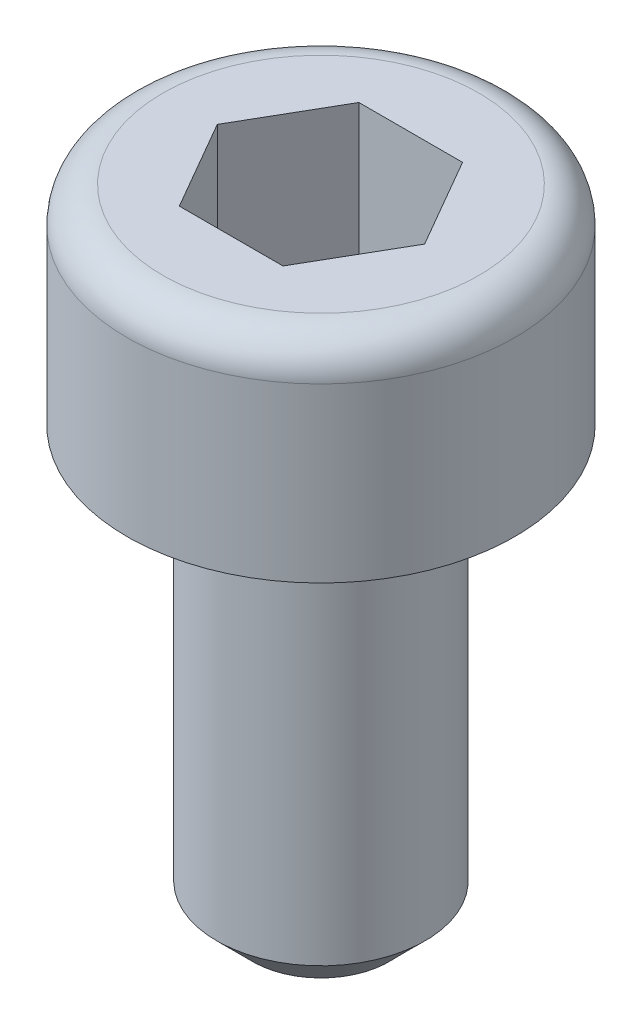
ISO-10303-21;
HEADER;
FILE_DESCRIPTION(('STEP AP214'),'2;1');
FILE_NAME('part.step','',(''),(''),'','','');
FILE_SCHEMA(('AUTOMOTIVE_DESIGN { 1 0 10303 214 1 1 1 1 }'));
ENDSEC;
DATA;
#1=APPLICATION_CONTEXT('core data for automotive mechanical design processes');
#2=APPLICATION_PROTOCOL_DEFINITION('international standard','automotive_design',2000,#1);
#3=PRODUCT_CONTEXT('',#1,'mechanical');
#4=PRODUCT('Part','Part','',(#3));
#5=PRODUCT_RELATED_PRODUCT_CATEGORY('part','',(#4));
#6=PRODUCT_DEFINITION_FORMATION('','',#4);
#7=PRODUCT_DEFINITION_CONTEXT('part definition',#1,'design');
#8=PRODUCT_DEFINITION('design','',#6,#7);
#9=PRODUCT_DEFINITION_SHAPE('','',#8);
#10=(LENGTH_UNIT() NAMED_UNIT(*) SI_UNIT(.MILLI.,.METRE.));
#11=(NAMED_UNIT(*) PLANE_ANGLE_UNIT() SI_UNIT($,.RADIAN.));
#12=(NAMED_UNIT(*) SI_UNIT($,.STERADIAN.) SOLID_ANGLE_UNIT());
#13=UNCERTAINTY_MEASURE_WITH_UNIT(LENGTH_MEASURE(1.E-05),#10,'distance_accuracy_value','');
#14=(GEOMETRIC_REPRESENTATION_CONTEXT(3) GLOBAL_UNCERTAINTY_ASSIGNED_CONTEXT((#13)) GLOBAL_UNIT_ASSIGNED_CONTEXT((#10,
#11,#12)) REPRESENTATION_CONTEXT('',''));
#15=CARTESIAN_POINT('',(0.,0.,0.));
#16=DIRECTION('',(0.,0.,1.));
#17=DIRECTION('',(1.,0.,0.));
#18=AXIS2_PLACEMENT_3D('',#15,#16,#17);
#19=CARTESIAN_POINT('',(0.,2.9,0.));
#20=DIRECTION('',(0.,1.,0.));
#21=DIRECTION('',(-1.,0.,0.));
#22=AXIS2_PLACEMENT_3D('',#19,#20,#21);
#23=PLANE('',#22);
#24=DIRECTION('',(0.5,0.,-0.866025403784439));
#25=VECTOR('',#24,1.);
#26=CARTESIAN_POINT('',(0.721687836487032,2.9,1.25));
#27=LINE('',#26,#25);
#28=CARTESIAN_POINT('',(0.721687836487032,2.9,1.25));
#29=VERTEX_POINT('',#28);
#30=CARTESIAN_POINT('',(1.44337567297406,2.9,0.));
#31=VERTEX_POINT('',#30);
#32=EDGE_CURVE('E44',#29,#31,#27,.T.);
#33=ORIENTED_EDGE('',*,*,#32,.F.);
#34=DIRECTION('',(1.,0.,0.));
#35=VECTOR('',#34,1.);
#36=CARTESIAN_POINT('',(-0.721687836487033,2.9,1.25));
#37=LINE('',#36,#35);
#38=CARTESIAN_POINT('',(-0.721687836487033,2.9,1.25));
#39=VERTEX_POINT('',#38);
#40=EDGE_CURVE('E127',#39,#29,#37,.T.);
#41=ORIENTED_EDGE('',*,*,#40,.F.);
#42=DIRECTION('',(0.5,0.,0.866025403784439));
#43=VECTOR('',#42,1.);
#44=CARTESIAN_POINT('',(-1.44337567297406,2.9,0.));
#45=LINE('',#44,#43);
#46=CARTESIAN_POINT('',(-1.44337567297406,2.9,0.));
#47=VERTEX_POINT('',#46);
#48=EDGE_CURVE('E125',#47,#39,#45,.T.);
#49=ORIENTED_EDGE('',*,*,#48,.F.);
#50=DIRECTION('',(-0.5,0.,0.866025403784439));
#51=VECTOR('',#50,1.);
#52=CARTESIAN_POINT('',(-0.721687836487032,2.9,-1.25));
#53=LINE('',#52,#51);
#54=CARTESIAN_POINT('',(-0.721687836487032,2.9,-1.25));
#55=VERTEX_POINT('',#54);
#56=EDGE_CURVE('E92',#55,#47,#53,.T.);
#57=ORIENTED_EDGE('',*,*,#56,.F.);
#58=DIRECTION('',(-1.,0.,0.));
#59=VECTOR('',#58,1.);
#60=CARTESIAN_POINT('',(0.721687836487033,2.9,-1.25));
#61=LINE('',#60,#59);
#62=CARTESIAN_POINT('',(0.721687836487033,2.9,-1.25));
#63=VERTEX_POINT('',#62);
#64=EDGE_CURVE('E121',#63,#55,#61,.T.);
#65=ORIENTED_EDGE('',*,*,#64,.F.);
#66=DIRECTION('',(-0.5,0.,-0.866025403784439));
#67=VECTOR('',#66,1.);
#68=CARTESIAN_POINT('',(1.44337567297406,2.9,0.));
#69=LINE('',#68,#67);
#70=EDGE_CURVE('E118',#31,#63,#69,.T.);
#71=ORIENTED_EDGE('',*,*,#70,.F.);
#72=EDGE_LOOP('',(#33,#41,#49,#57,#65,#71));
#73=FACE_BOUND('',#72,.T.);
#74=CARTESIAN_POINT('',(0.,2.9,0.));
#75=DIRECTION('',(0.,1.,0.));
#76=DIRECTION('',(-1.,0.,0.));
#77=AXIS2_PLACEMENT_3D('',#74,#75,#76);
#78=CIRCLE('',#77,2.2);
#79=CARTESIAN_POINT('',(-2.2,2.9,0.));
#80=VERTEX_POINT('',#79);
#81=EDGE_CURVE('E11',#80,#80,#78,.T.);
#82=ORIENTED_EDGE('',*,*,#81,.T.);
#83=EDGE_LOOP('',(#82));
#84=FACE_BOUND('',#83,.T.);
#85=ADVANCED_FACE('F30',(#73,#84),#23,.T.);
#86=CARTESIAN_POINT('',(0.,2.4,0.));
#87=DIRECTION('',(0.,1.,0.));
#88=DIRECTION('',(-1.,0.,0.));
#89=AXIS2_PLACEMENT_3D('',#86,#87,#88);
#90=TOROIDAL_SURFACE('',#89,2.2,0.5);
#91=CARTESIAN_POINT('',(0.,2.4,0.));
#92=DIRECTION('',(0.,1.,0.));
#93=DIRECTION('',(-1.,0.,0.));
#94=AXIS2_PLACEMENT_3D('',#91,#92,#93);
#95=CIRCLE('',#94,2.7);
#96=CARTESIAN_POINT('',(-2.7,2.4,0.));
#97=VERTEX_POINT('',#96);
#98=EDGE_CURVE('E37',#97,#97,#95,.T.);
#99=ORIENTED_EDGE('',*,*,#98,.T.);
#100=EDGE_LOOP('',(#99));
#101=FACE_BOUND('',#100,.T.);
#102=ORIENTED_EDGE('',*,*,#81,.F.);
#103=EDGE_LOOP('',(#102));
#104=FACE_BOUND('',#103,.T.);
#105=ADVANCED_FACE('F150',(#101,#104),#90,.T.);
#106=CARTESIAN_POINT('',(0.,15.8257226222034,0.));
#107=DIRECTION('',(0.,1.,0.));
#108=DIRECTION('',(-1.,0.,0.));
#109=AXIS2_PLACEMENT_3D('',#106,#107,#108);
#110=CYLINDRICAL_SURFACE('',#109,2.7);
#111=CARTESIAN_POINT('',(0.,0.,0.));
#112=DIRECTION('',(0.,1.,0.));
#113=DIRECTION('',(-1.,0.,0.));
#114=AXIS2_PLACEMENT_3D('',#111,#112,#113);
#115=CIRCLE('',#114,2.7);
#116=CARTESIAN_POINT('',(-2.7,0.,0.));
#117=VERTEX_POINT('',#116);
#118=EDGE_CURVE('E145',#117,#117,#115,.T.);
#119=ORIENTED_EDGE('',*,*,#118,.T.);
#120=EDGE_LOOP('',(#119));
#121=FACE_BOUND('',#120,.T.);
#122=ORIENTED_EDGE('',*,*,#98,.F.);
#123=EDGE_LOOP('',(#122));
#124=FACE_BOUND('',#123,.T.);
#125=ADVANCED_FACE('F153',(#121,#124),#110,.T.);
#126=CARTESIAN_POINT('',(-2.7,0.,0.));
#127=DIRECTION('',(0.,-1.,0.));
#128=DIRECTION('',(1.,0.,0.));
#129=AXIS2_PLACEMENT_3D('',#126,#127,#128);
#130=PLANE('',#129);
#131=CARTESIAN_POINT('',(0.,0.,0.));
#132=DIRECTION('',(0.,1.,0.));
#133=DIRECTION('',(-1.,0.,0.));
#134=AXIS2_PLACEMENT_3D('',#131,#132,#133);
#135=CIRCLE('',#134,1.45);
#136=CARTESIAN_POINT('',(-1.45,0.,0.));
#137=VERTEX_POINT('',#136);
#138=EDGE_CURVE('E142',#137,#137,#135,.T.);
#139=ORIENTED_EDGE('',*,*,#138,.T.);
#140=EDGE_LOOP('',(#139));
#141=FACE_BOUND('',#140,.T.);
#142=ORIENTED_EDGE('',*,*,#118,.F.);
#143=EDGE_LOOP('',(#142));
#144=FACE_BOUND('',#143,.T.);
#145=ADVANCED_FACE('F155',(#141,#144),#130,.T.);
#146=CARTESIAN_POINT('',(0.,15.8257226222034,0.));
#147=DIRECTION('',(0.,1.,0.));
#148=DIRECTION('',(-1.,0.,0.));
#149=AXIS2_PLACEMENT_3D('',#146,#147,#148);
#150=CYLINDRICAL_SURFACE('',#149,1.45);
#151=CARTESIAN_POINT('',(0.,-5.5,0.));
#152=DIRECTION('',(0.,1.,0.));
#153=DIRECTION('',(-1.,0.,0.));
#154=AXIS2_PLACEMENT_3D('',#151,#152,#153);
#155=CIRCLE('',#154,1.45);
#156=CARTESIAN_POINT('',(-1.45,-5.5,0.));
#157=VERTEX_POINT('',#156);
#158=EDGE_CURVE('E139',#157,#157,#155,.T.);
#159=ORIENTED_EDGE('',*,*,#158,.T.);
#160=EDGE_LOOP('',(#159));
#161=FACE_BOUND('',#160,.T.);
#162=ORIENTED_EDGE('',*,*,#138,.F.);
#163=EDGE_LOOP('',(#162));
#164=FACE_BOUND('',#163,.T.);
#165=ADVANCED_FACE('F162',(#161,#164),#150,.T.);
#166=CARTESIAN_POINT('',(0.,-5.5,0.));
#167=DIRECTION('',(0.,1.,0.));
#168=DIRECTION('',(-1.,0.,0.));
#169=AXIS2_PLACEMENT_3D('',#166,#167,#168);
#170=CONICAL_SURFACE('',#169,1.45,0.785398163397448);
#171=CARTESIAN_POINT('',(0.,-6.,0.));
#172=DIRECTION('',(0.,1.,0.));
#173=DIRECTION('',(-1.,0.,0.));
#174=AXIS2_PLACEMENT_3D('',#171,#172,#173);
#175=CIRCLE('',#174,0.949999999999998);
#176=CARTESIAN_POINT('',(-0.949999999999997,-6.,0.));
#177=VERTEX_POINT('',#176);
#178=EDGE_CURVE('E131',#177,#177,#175,.T.);
#179=ORIENTED_EDGE('',*,*,#178,.T.);
#180=EDGE_LOOP('',(#179));
#181=FACE_BOUND('',#180,.T.);
#182=ORIENTED_EDGE('',*,*,#158,.F.);
#183=EDGE_LOOP('',(#182));
#184=FACE_BOUND('',#183,.T.);
#185=ADVANCED_FACE('F187',(#181,#184),#170,.T.);
#186=CARTESIAN_POINT('',(-0.949999999999997,-6.,0.));
#187=DIRECTION('',(0.,-1.,0.));
#188=DIRECTION('',(1.,0.,0.));
#189=AXIS2_PLACEMENT_3D('',#186,#187,#188);
#190=PLANE('',#189);
#191=ORIENTED_EDGE('',*,*,#178,.F.);
#192=EDGE_LOOP('',(#191));
#193=FACE_BOUND('',#192,.T.);
#194=ADVANCED_FACE('F180',(#193),#190,.T.);
#195=CARTESIAN_POINT('',(0.721687836487032,0.9,1.25));
#196=DIRECTION('',(0.866025403784439,0.,0.5));
#197=DIRECTION('',(0.5,0.,-0.866025403784439));
#198=AXIS2_PLACEMENT_3D('',#195,#196,#197);
#199=PLANE('',#198);
#200=ORIENTED_EDGE('',*,*,#32,.T.);
#201=DIRECTION('',(0.,1.,0.));
#202=VECTOR('',#201,1.);
#203=CARTESIAN_POINT('',(1.44337567297406,0.9,0.));
#204=LINE('',#203,#202);
#205=CARTESIAN_POINT('',(1.44337567297406,0.9,0.));
#206=VERTEX_POINT('',#205);
#207=EDGE_CURVE('E74',#206,#31,#204,.T.);
#208=ORIENTED_EDGE('',*,*,#207,.F.);
#209=DIRECTION('',(0.5,0.,-0.866025403784439));
#210=VECTOR('',#209,1.);
#211=CARTESIAN_POINT('',(0.721687836487032,0.9,1.25));
#212=LINE('',#211,#210);
#213=CARTESIAN_POINT('',(0.721687836487032,0.9,1.25));
#214=VERTEX_POINT('',#213);
#215=EDGE_CURVE('E129',#214,#206,#212,.T.);
#216=ORIENTED_EDGE('',*,*,#215,.F.);
#217=DIRECTION('',(0.,1.,0.));
#218=VECTOR('',#217,1.);
#219=CARTESIAN_POINT('',(0.721687836487032,0.9,1.25));
#220=LINE('',#219,#218);
#221=EDGE_CURVE('E52',#214,#29,#220,.T.);
#222=ORIENTED_EDGE('',*,*,#221,.T.);
#223=EDGE_LOOP('',(#200,#208,#216,#222));
#224=FACE_BOUND('',#223,.T.);
#225=ADVANCED_FACE('F177',(#224),#199,.F.);
#226=CARTESIAN_POINT('',(-0.721687836487033,0.9,1.25));
#227=DIRECTION('',(0.,0.,1.));
#228=DIRECTION('',(1.,0.,0.));
#229=AXIS2_PLACEMENT_3D('',#226,#227,#228);
#230=PLANE('',#229);
#231=ORIENTED_EDGE('',*,*,#40,.T.);
#232=ORIENTED_EDGE('',*,*,#221,.F.);
#233=DIRECTION('',(1.,0.,0.));
#234=VECTOR('',#233,1.);
#235=CARTESIAN_POINT('',(-0.721687836487033,0.9,1.25));
#236=LINE('',#235,#234);
#237=CARTESIAN_POINT('',(-0.721687836487033,0.9,1.25));
#238=VERTEX_POINT('',#237);
#239=EDGE_CURVE('E104',#238,#214,#236,.T.);
#240=ORIENTED_EDGE('',*,*,#239,.F.);
#241=DIRECTION('',(0.,1.,0.));
#242=VECTOR('',#241,1.);
#243=CARTESIAN_POINT('',(-0.721687836487033,0.9,1.25));
#244=LINE('',#243,#242);
#245=EDGE_CURVE('E96',#238,#39,#244,.T.);
#246=ORIENTED_EDGE('',*,*,#245,.T.);
#247=EDGE_LOOP('',(#231,#232,#240,#246));
#248=FACE_BOUND('',#247,.T.);
#249=ADVANCED_FACE('F179',(#248),#230,.F.);
#250=CARTESIAN_POINT('',(-1.44337567297406,0.9,0.));
#251=DIRECTION('',(-0.866025403784439,0.,0.5));
#252=DIRECTION('',(0.5,0.,0.866025403784439));
#253=AXIS2_PLACEMENT_3D('',#250,#251,#252);
#254=PLANE('',#253);
#255=ORIENTED_EDGE('',*,*,#48,.T.);
#256=ORIENTED_EDGE('',*,*,#245,.F.);
#257=DIRECTION('',(0.5,0.,0.866025403784439));
#258=VECTOR('',#257,1.);
#259=CARTESIAN_POINT('',(-1.44337567297406,0.9,0.));
#260=LINE('',#259,#258);
#261=CARTESIAN_POINT('',(-1.44337567297406,0.9,0.));
#262=VERTEX_POINT('',#261);
#263=EDGE_CURVE('E100',#262,#238,#260,.T.);
#264=ORIENTED_EDGE('',*,*,#263,.F.);
#265=DIRECTION('',(0.,1.,0.));
#266=VECTOR('',#265,1.);
#267=CARTESIAN_POINT('',(-1.44337567297406,0.9,0.));
#268=LINE('',#267,#266);
#269=EDGE_CURVE('E85',#262,#47,#268,.T.);
#270=ORIENTED_EDGE('',*,*,#269,.T.);
#271=EDGE_LOOP('',(#255,#256,#264,#270));
#272=FACE_BOUND('',#271,.T.);
#273=ADVANCED_FACE('F101',(#272),#254,.F.);
#274=CARTESIAN_POINT('',(-0.721687836487031,0.9,-1.25));
#275=DIRECTION('',(-0.866025403784439,0.,-0.5));
#276=DIRECTION('',(-0.5,0.,0.866025403784439));
#277=AXIS2_PLACEMENT_3D('',#274,#275,#276);
#278=PLANE('',#277);
#279=ORIENTED_EDGE('',*,*,#56,.T.);
#280=ORIENTED_EDGE('',*,*,#269,.F.);
#281=DIRECTION('',(-0.5,0.,0.866025403784439));
#282=VECTOR('',#281,1.);
#283=CARTESIAN_POINT('',(-0.721687836487031,0.9,-1.25));
#284=LINE('',#283,#282);
#285=CARTESIAN_POINT('',(-0.721687836487031,0.9,-1.25));
#286=VERTEX_POINT('',#285);
#287=EDGE_CURVE('E89',#286,#262,#284,.T.);
#288=ORIENTED_EDGE('',*,*,#287,.F.);
#289=DIRECTION('',(0.,1.,0.));
#290=VECTOR('',#289,1.);
#291=CARTESIAN_POINT('',(-0.721687836487031,0.9,-1.25));
#292=LINE('',#291,#290);
#293=EDGE_CURVE('E97',#286,#55,#292,.T.);
#294=ORIENTED_EDGE('',*,*,#293,.T.);
#295=EDGE_LOOP('',(#279,#280,#288,#294));
#296=FACE_BOUND('',#295,.T.);
#297=ADVANCED_FACE('F87',(#296),#278,.F.);
#298=CARTESIAN_POINT('',(0.721687836487033,0.9,-1.25));
#299=DIRECTION('',(0.,0.,-1.));
#300=DIRECTION('',(-1.,0.,0.));
#301=AXIS2_PLACEMENT_3D('',#298,#299,#300);
#302=PLANE('',#301);
#303=ORIENTED_EDGE('',*,*,#64,.T.);
#304=ORIENTED_EDGE('',*,*,#293,.F.);
#305=DIRECTION('',(-1.,0.,0.));
#306=VECTOR('',#305,1.);
#307=CARTESIAN_POINT('',(0.721687836487033,0.9,-1.25));
#308=LINE('',#307,#306);
#309=CARTESIAN_POINT('',(0.721687836487033,0.9,-1.25));
#310=VERTEX_POINT('',#309);
#311=EDGE_CURVE('E110',#310,#286,#308,.T.);
#312=ORIENTED_EDGE('',*,*,#311,.F.);
#313=DIRECTION('',(0.,1.,0.));
#314=VECTOR('',#313,1.);
#315=CARTESIAN_POINT('',(0.721687836487033,0.9,-1.25));
#316=LINE('',#315,#314);
#317=EDGE_CURVE('E134',#310,#63,#316,.T.);
#318=ORIENTED_EDGE('',*,*,#317,.T.);
#319=EDGE_LOOP('',(#303,#304,#312,#318));
#320=FACE_BOUND('',#319,.T.);
#321=ADVANCED_FACE('F248',(#320),#302,.F.);
#322=CARTESIAN_POINT('',(1.44337567297406,0.9,0.));
#323=DIRECTION('',(0.866025403784439,0.,-0.5));
#324=DIRECTION('',(-0.5,0.,-0.866025403784439));
#325=AXIS2_PLACEMENT_3D('',#322,#323,#324);
#326=PLANE('',#325);
#327=ORIENTED_EDGE('',*,*,#70,.T.);
#328=ORIENTED_EDGE('',*,*,#317,.F.);
#329=DIRECTION('',(-0.5,0.,-0.866025403784439));
#330=VECTOR('',#329,1.);
#331=CARTESIAN_POINT('',(1.44337567297406,0.9,0.));
#332=LINE('',#331,#330);
#333=EDGE_CURVE('E112',#206,#310,#332,.T.);
#334=ORIENTED_EDGE('',*,*,#333,.F.);
#335=ORIENTED_EDGE('',*,*,#207,.T.);
#336=EDGE_LOOP('',(#327,#328,#334,#335));
#337=FACE_BOUND('',#336,.T.);
#338=ADVANCED_FACE('F175',(#337),#326,.F.);
#339=CARTESIAN_POINT('',(0.,0.9,2.5));
#340=DIRECTION('',(0.,-1.,0.));
#341=DIRECTION('',(0.,0.,-1.));
#342=AXIS2_PLACEMENT_3D('',#339,#340,#341);
#343=PLANE('',#342);
#344=ORIENTED_EDGE('',*,*,#215,.T.);
#345=ORIENTED_EDGE('',*,*,#333,.T.);
#346=ORIENTED_EDGE('',*,*,#311,.T.);
#347=ORIENTED_EDGE('',*,*,#287,.T.);
#348=ORIENTED_EDGE('',*,*,#263,.T.);
#349=ORIENTED_EDGE('',*,*,#239,.T.);
#350=EDGE_LOOP('',(#344,#345,#346,#347,#348,#349));
#351=FACE_BOUND('',#350,.T.);
#352=ADVANCED_FACE('F107',(#351),#343,.F.);
#353=CLOSED_SHELL('',(#85,#105,#125,#145,#165,#185,#194,#225,#249,#273,#297,#321,#338,#352));
#354=MANIFOLD_SOLID_BREP('B2',#353);
#355=ADVANCED_BREP_SHAPE_REPRESENTATION('',(#18,#354),#14);
#356=SHAPE_DEFINITION_REPRESENTATION(#9,#355);
ENDSEC;
END-ISO-10303-21;
